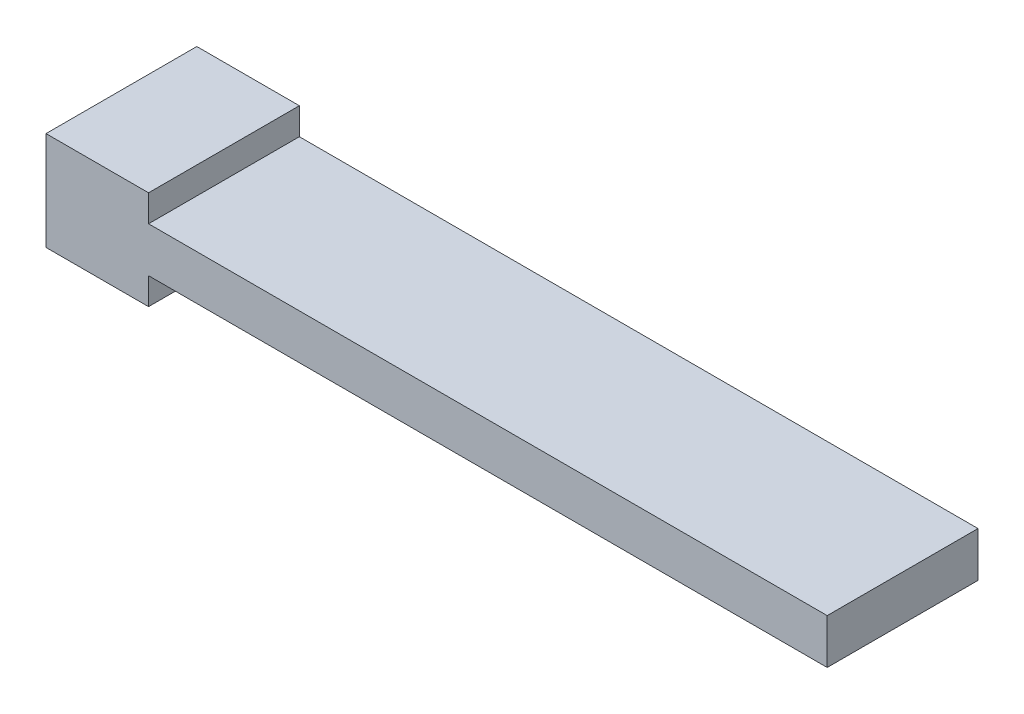
ISO-10303-21;
HEADER;
FILE_DESCRIPTION(('STEP AP214'),'2;1');
FILE_NAME('part.step','',(''),(''),'','','');
FILE_SCHEMA(('AUTOMOTIVE_DESIGN { 1 0 10303 214 1 1 1 1 }'));
ENDSEC;
DATA;
#1=APPLICATION_CONTEXT('core data for automotive mechanical design processes');
#2=APPLICATION_PROTOCOL_DEFINITION('international standard','automotive_design',2000,#1);
#3=PRODUCT_CONTEXT('',#1,'mechanical');
#4=PRODUCT('Part','Part','',(#3));
#5=PRODUCT_RELATED_PRODUCT_CATEGORY('part','',(#4));
#6=PRODUCT_DEFINITION_FORMATION('','',#4);
#7=PRODUCT_DEFINITION_CONTEXT('part definition',#1,'design');
#8=PRODUCT_DEFINITION('design','',#6,#7);
#9=PRODUCT_DEFINITION_SHAPE('','',#8);
#10=(LENGTH_UNIT() NAMED_UNIT(*) SI_UNIT(.MILLI.,.METRE.));
#11=(NAMED_UNIT(*) PLANE_ANGLE_UNIT() SI_UNIT($,.RADIAN.));
#12=(NAMED_UNIT(*) SI_UNIT($,.STERADIAN.) SOLID_ANGLE_UNIT());
#13=UNCERTAINTY_MEASURE_WITH_UNIT(LENGTH_MEASURE(1.E-05),#10,'distance_accuracy_value','');
#14=(GEOMETRIC_REPRESENTATION_CONTEXT(3) GLOBAL_UNCERTAINTY_ASSIGNED_CONTEXT((#13)) GLOBAL_UNIT_ASSIGNED_CONTEXT((#10,
#11,#12)) REPRESENTATION_CONTEXT('',''));
#15=CARTESIAN_POINT('',(0.,0.,0.));
#16=DIRECTION('',(0.,0.,1.));
#17=DIRECTION('',(1.,0.,0.));
#18=AXIS2_PLACEMENT_3D('',#15,#16,#17);
#19=CARTESIAN_POINT('',(6.8,-3.6125,10.));
#20=DIRECTION('',(0.,1.,0.));
#21=DIRECTION('',(-1.,0.,0.));
#22=AXIS2_PLACEMENT_3D('',#19,#20,#21);
#23=PLANE('',#22);
#24=DIRECTION('',(1.,0.,0.));
#25=VECTOR('',#24,1.);
#26=CARTESIAN_POINT('',(6.8,-3.6125,0.));
#27=LINE('',#26,#25);
#28=CARTESIAN_POINT('',(0.,-3.6125,0.));
#29=VERTEX_POINT('',#28);
#30=CARTESIAN_POINT('',(6.8,-3.6125,0.));
#31=VERTEX_POINT('',#30);
#32=EDGE_CURVE('E150',#29,#31,#27,.T.);
#33=ORIENTED_EDGE('',*,*,#32,.T.);
#34=DIRECTION('',(0.,0.,-1.));
#35=VECTOR('',#34,1.);
#36=CARTESIAN_POINT('',(6.8,-3.6125,10.));
#37=LINE('',#36,#35);
#38=CARTESIAN_POINT('',(6.8,-3.6125,10.));
#39=VERTEX_POINT('',#38);
#40=EDGE_CURVE('E54',#39,#31,#37,.T.);
#41=ORIENTED_EDGE('',*,*,#40,.F.);
#42=DIRECTION('',(1.,0.,0.));
#43=VECTOR('',#42,1.);
#44=CARTESIAN_POINT('',(6.8,-3.6125,10.));
#45=LINE('',#44,#43);
#46=CARTESIAN_POINT('',(0.,-3.6125,10.));
#47=VERTEX_POINT('',#46);
#48=EDGE_CURVE('E106',#47,#39,#45,.T.);
#49=ORIENTED_EDGE('',*,*,#48,.F.);
#50=DIRECTION('',(0.,0.,-1.));
#51=VECTOR('',#50,1.);
#52=CARTESIAN_POINT('',(0.,-3.6125,10.));
#53=LINE('',#52,#51);
#54=EDGE_CURVE('E11',#47,#29,#53,.T.);
#55=ORIENTED_EDGE('',*,*,#54,.T.);
#56=EDGE_LOOP('',(#33,#41,#49,#55));
#57=FACE_BOUND('',#56,.T.);
#58=ADVANCED_FACE('F45',(#57),#23,.F.);
#59=CARTESIAN_POINT('',(6.8,-1.8325,10.));
#60=DIRECTION('',(-1.,0.,0.));
#61=DIRECTION('',(0.,-1.,0.));
#62=AXIS2_PLACEMENT_3D('',#59,#60,#61);
#63=PLANE('',#62);
#64=DIRECTION('',(0.,1.,0.));
#65=VECTOR('',#64,1.);
#66=CARTESIAN_POINT('',(6.8,-1.8325,0.));
#67=LINE('',#66,#65);
#68=CARTESIAN_POINT('',(6.8,-1.8325,0.));
#69=VERTEX_POINT('',#68);
#70=EDGE_CURVE('E153',#31,#69,#67,.T.);
#71=ORIENTED_EDGE('',*,*,#70,.T.);
#72=DIRECTION('',(0.,0.,-1.));
#73=VECTOR('',#72,1.);
#74=CARTESIAN_POINT('',(6.8,-1.8325,10.));
#75=LINE('',#74,#73);
#76=CARTESIAN_POINT('',(6.8,-1.8325,10.));
#77=VERTEX_POINT('',#76);
#78=EDGE_CURVE('E181',#77,#69,#75,.T.);
#79=ORIENTED_EDGE('',*,*,#78,.F.);
#80=DIRECTION('',(0.,1.,0.));
#81=VECTOR('',#80,1.);
#82=CARTESIAN_POINT('',(6.8,-1.8325,10.));
#83=LINE('',#82,#81);
#84=EDGE_CURVE('E191',#39,#77,#83,.T.);
#85=ORIENTED_EDGE('',*,*,#84,.F.);
#86=ORIENTED_EDGE('',*,*,#40,.T.);
#87=EDGE_LOOP('',(#71,#79,#85,#86));
#88=FACE_BOUND('',#87,.T.);
#89=ADVANCED_FACE('F189',(#88),#63,.F.);
#90=CARTESIAN_POINT('',(51.8,-1.83249999999999,10.));
#91=DIRECTION('',(0.,1.,0.));
#92=DIRECTION('',(-1.,0.,0.));
#93=AXIS2_PLACEMENT_3D('',#90,#91,#92);
#94=PLANE('',#93);
#95=DIRECTION('',(1.,0.,0.));
#96=VECTOR('',#95,1.);
#97=CARTESIAN_POINT('',(51.8,-1.83249999999999,0.));
#98=LINE('',#97,#96);
#99=CARTESIAN_POINT('',(51.8,-1.83249999999999,0.));
#100=VERTEX_POINT('',#99);
#101=EDGE_CURVE('E156',#69,#100,#98,.T.);
#102=ORIENTED_EDGE('',*,*,#101,.T.);
#103=DIRECTION('',(0.,0.,-1.));
#104=VECTOR('',#103,1.);
#105=CARTESIAN_POINT('',(51.8,-1.83249999999999,10.));
#106=LINE('',#105,#104);
#107=CARTESIAN_POINT('',(51.8,-1.83249999999999,10.));
#108=VERTEX_POINT('',#107);
#109=EDGE_CURVE('E177',#108,#100,#106,.T.);
#110=ORIENTED_EDGE('',*,*,#109,.F.);
#111=DIRECTION('',(1.,0.,0.));
#112=VECTOR('',#111,1.);
#113=CARTESIAN_POINT('',(51.8,-1.83249999999999,10.));
#114=LINE('',#113,#112);
#115=EDGE_CURVE('E205',#77,#108,#114,.T.);
#116=ORIENTED_EDGE('',*,*,#115,.F.);
#117=ORIENTED_EDGE('',*,*,#78,.T.);
#118=EDGE_LOOP('',(#102,#110,#116,#117));
#119=FACE_BOUND('',#118,.T.);
#120=ADVANCED_FACE('F200',(#119),#94,.F.);
#121=CARTESIAN_POINT('',(51.8,1.1475,10.));
#122=DIRECTION('',(-1.,0.,0.));
#123=DIRECTION('',(0.,0.,1.));
#124=AXIS2_PLACEMENT_3D('',#121,#122,#123);
#125=PLANE('',#124);
#126=DIRECTION('',(0.,1.,0.));
#127=VECTOR('',#126,1.);
#128=CARTESIAN_POINT('',(51.8,1.1475,0.));
#129=LINE('',#128,#127);
#130=CARTESIAN_POINT('',(51.8,1.1475,0.));
#131=VERTEX_POINT('',#130);
#132=EDGE_CURVE('E159',#100,#131,#129,.T.);
#133=ORIENTED_EDGE('',*,*,#132,.T.);
#134=DIRECTION('',(0.,0.,-1.));
#135=VECTOR('',#134,1.);
#136=CARTESIAN_POINT('',(51.8,1.1475,10.));
#137=LINE('',#136,#135);
#138=CARTESIAN_POINT('',(51.8,1.1475,10.));
#139=VERTEX_POINT('',#138);
#140=EDGE_CURVE('E137',#139,#131,#137,.T.);
#141=ORIENTED_EDGE('',*,*,#140,.F.);
#142=DIRECTION('',(0.,1.,0.));
#143=VECTOR('',#142,1.);
#144=CARTESIAN_POINT('',(51.8,1.1475,10.));
#145=LINE('',#144,#143);
#146=EDGE_CURVE('E126',#108,#139,#145,.T.);
#147=ORIENTED_EDGE('',*,*,#146,.F.);
#148=ORIENTED_EDGE('',*,*,#109,.T.);
#149=EDGE_LOOP('',(#133,#141,#147,#148));
#150=FACE_BOUND('',#149,.T.);
#151=ADVANCED_FACE('F203',(#150),#125,.F.);
#152=CARTESIAN_POINT('',(6.8,1.1475,10.));
#153=DIRECTION('',(0.,-1.,0.));
#154=DIRECTION('',(0.,0.,-1.));
#155=AXIS2_PLACEMENT_3D('',#152,#153,#154);
#156=PLANE('',#155);
#157=DIRECTION('',(-1.,0.,0.));
#158=VECTOR('',#157,1.);
#159=CARTESIAN_POINT('',(6.8,1.1475,0.));
#160=LINE('',#159,#158);
#161=CARTESIAN_POINT('',(6.8,1.1475,0.));
#162=VERTEX_POINT('',#161);
#163=EDGE_CURVE('E135',#131,#162,#160,.T.);
#164=ORIENTED_EDGE('',*,*,#163,.T.);
#165=DIRECTION('',(0.,0.,-1.));
#166=VECTOR('',#165,1.);
#167=CARTESIAN_POINT('',(6.8,1.1475,10.));
#168=LINE('',#167,#166);
#169=CARTESIAN_POINT('',(6.8,1.1475,10.));
#170=VERTEX_POINT('',#169);
#171=EDGE_CURVE('E132',#170,#162,#168,.T.);
#172=ORIENTED_EDGE('',*,*,#171,.F.);
#173=DIRECTION('',(-1.,0.,0.));
#174=VECTOR('',#173,1.);
#175=CARTESIAN_POINT('',(6.8,1.1475,10.));
#176=LINE('',#175,#174);
#177=EDGE_CURVE('E120',#139,#170,#176,.T.);
#178=ORIENTED_EDGE('',*,*,#177,.F.);
#179=ORIENTED_EDGE('',*,*,#140,.T.);
#180=EDGE_LOOP('',(#164,#172,#178,#179));
#181=FACE_BOUND('',#180,.T.);
#182=ADVANCED_FACE('F133',(#181),#156,.F.);
#183=CARTESIAN_POINT('',(6.8,2.9275,10.));
#184=DIRECTION('',(-1.,0.,0.));
#185=DIRECTION('',(0.,0.,1.));
#186=AXIS2_PLACEMENT_3D('',#183,#184,#185);
#187=PLANE('',#186);
#188=DIRECTION('',(0.,1.,0.));
#189=VECTOR('',#188,1.);
#190=CARTESIAN_POINT('',(6.8,2.9275,0.));
#191=LINE('',#190,#189);
#192=CARTESIAN_POINT('',(6.8,2.9275,0.));
#193=VERTEX_POINT('',#192);
#194=EDGE_CURVE('E92',#162,#193,#191,.T.);
#195=ORIENTED_EDGE('',*,*,#194,.T.);
#196=DIRECTION('',(0.,0.,-1.));
#197=VECTOR('',#196,1.);
#198=CARTESIAN_POINT('',(6.8,2.9275,10.));
#199=LINE('',#198,#197);
#200=CARTESIAN_POINT('',(6.8,2.9275,10.));
#201=VERTEX_POINT('',#200);
#202=EDGE_CURVE('E138',#201,#193,#199,.T.);
#203=ORIENTED_EDGE('',*,*,#202,.F.);
#204=DIRECTION('',(0.,1.,0.));
#205=VECTOR('',#204,1.);
#206=CARTESIAN_POINT('',(6.8,2.9275,10.));
#207=LINE('',#206,#205);
#208=EDGE_CURVE('E124',#170,#201,#207,.T.);
#209=ORIENTED_EDGE('',*,*,#208,.F.);
#210=ORIENTED_EDGE('',*,*,#171,.T.);
#211=EDGE_LOOP('',(#195,#203,#209,#210));
#212=FACE_BOUND('',#211,.T.);
#213=ADVANCED_FACE('F140',(#212),#187,.F.);
#214=CARTESIAN_POINT('',(0.,2.9275,10.));
#215=DIRECTION('',(0.,-1.,0.));
#216=DIRECTION('',(1.,0.,0.));
#217=AXIS2_PLACEMENT_3D('',#214,#215,#216);
#218=PLANE('',#217);
#219=DIRECTION('',(-1.,0.,0.));
#220=VECTOR('',#219,1.);
#221=CARTESIAN_POINT('',(0.,2.9275,0.));
#222=LINE('',#221,#220);
#223=CARTESIAN_POINT('',(0.,2.9275,0.));
#224=VERTEX_POINT('',#223);
#225=EDGE_CURVE('E99',#193,#224,#222,.T.);
#226=ORIENTED_EDGE('',*,*,#225,.T.);
#227=DIRECTION('',(0.,0.,-1.));
#228=VECTOR('',#227,1.);
#229=CARTESIAN_POINT('',(0.,2.9275,10.));
#230=LINE('',#229,#228);
#231=CARTESIAN_POINT('',(0.,2.9275,10.));
#232=VERTEX_POINT('',#231);
#233=EDGE_CURVE('E146',#232,#224,#230,.T.);
#234=ORIENTED_EDGE('',*,*,#233,.F.);
#235=DIRECTION('',(-1.,0.,0.));
#236=VECTOR('',#235,1.);
#237=CARTESIAN_POINT('',(0.,2.9275,10.));
#238=LINE('',#237,#236);
#239=EDGE_CURVE('E143',#201,#232,#238,.T.);
#240=ORIENTED_EDGE('',*,*,#239,.F.);
#241=ORIENTED_EDGE('',*,*,#202,.T.);
#242=EDGE_LOOP('',(#226,#234,#240,#241));
#243=FACE_BOUND('',#242,.T.);
#244=ADVANCED_FACE('F230',(#243),#218,.F.);
#245=CARTESIAN_POINT('',(0.,0.,10.));
#246=DIRECTION('',(1.,0.,0.));
#247=DIRECTION('',(0.,0.,-1.));
#248=AXIS2_PLACEMENT_3D('',#245,#246,#247);
#249=PLANE('',#248);
#250=DIRECTION('',(0.,-1.,0.));
#251=VECTOR('',#250,1.);
#252=CARTESIAN_POINT('',(0.,0.,0.));
#253=LINE('',#252,#251);
#254=EDGE_CURVE('E168',#224,#29,#253,.T.);
#255=ORIENTED_EDGE('',*,*,#254,.T.);
#256=ORIENTED_EDGE('',*,*,#54,.F.);
#257=DIRECTION('',(0.,-1.,0.));
#258=VECTOR('',#257,1.);
#259=CARTESIAN_POINT('',(0.,-3.6125,10.));
#260=LINE('',#259,#258);
#261=EDGE_CURVE('E62',#232,#47,#260,.T.);
#262=ORIENTED_EDGE('',*,*,#261,.F.);
#263=ORIENTED_EDGE('',*,*,#233,.T.);
#264=EDGE_LOOP('',(#255,#256,#262,#263));
#265=FACE_BOUND('',#264,.T.);
#266=ADVANCED_FACE('F214',(#265),#249,.F.);
#267=CARTESIAN_POINT('',(0.,0.,10.));
#268=DIRECTION('',(0.,0.,-1.));
#269=DIRECTION('',(-1.,0.,0.));
#270=AXIS2_PLACEMENT_3D('',#267,#268,#269);
#271=PLANE('',#270);
#272=ORIENTED_EDGE('',*,*,#261,.T.);
#273=ORIENTED_EDGE('',*,*,#48,.T.);
#274=ORIENTED_EDGE('',*,*,#84,.T.);
#275=ORIENTED_EDGE('',*,*,#115,.T.);
#276=ORIENTED_EDGE('',*,*,#146,.T.);
#277=ORIENTED_EDGE('',*,*,#177,.T.);
#278=ORIENTED_EDGE('',*,*,#208,.T.);
#279=ORIENTED_EDGE('',*,*,#239,.T.);
#280=EDGE_LOOP('',(#272,#273,#274,#275,#276,#277,#278,#279));
#281=FACE_BOUND('',#280,.T.);
#282=ADVANCED_FACE('F122',(#281),#271,.F.);
#283=CARTESIAN_POINT('',(0.,0.,0.));
#284=DIRECTION('',(0.,0.,-1.));
#285=DIRECTION('',(-1.,0.,0.));
#286=AXIS2_PLACEMENT_3D('',#283,#284,#285);
#287=PLANE('',#286);
#288=ORIENTED_EDGE('',*,*,#32,.F.);
#289=ORIENTED_EDGE('',*,*,#254,.F.);
#290=ORIENTED_EDGE('',*,*,#225,.F.);
#291=ORIENTED_EDGE('',*,*,#194,.F.);
#292=ORIENTED_EDGE('',*,*,#163,.F.);
#293=ORIENTED_EDGE('',*,*,#132,.F.);
#294=ORIENTED_EDGE('',*,*,#101,.F.);
#295=ORIENTED_EDGE('',*,*,#70,.F.);
#296=EDGE_LOOP('',(#288,#289,#290,#291,#292,#293,#294,#295));
#297=FACE_BOUND('',#296,.T.);
#298=ADVANCED_FACE('F195',(#297),#287,.T.);
#299=CLOSED_SHELL('',(#58,#89,#120,#151,#182,#213,#244,#266,#282,#298));
#300=MANIFOLD_SOLID_BREP('B2',#299);
#301=ADVANCED_BREP_SHAPE_REPRESENTATION('',(#18,#300),#14);
#302=SHAPE_DEFINITION_REPRESENTATION(#9,#301);
ENDSEC;
END-ISO-10303-21;
